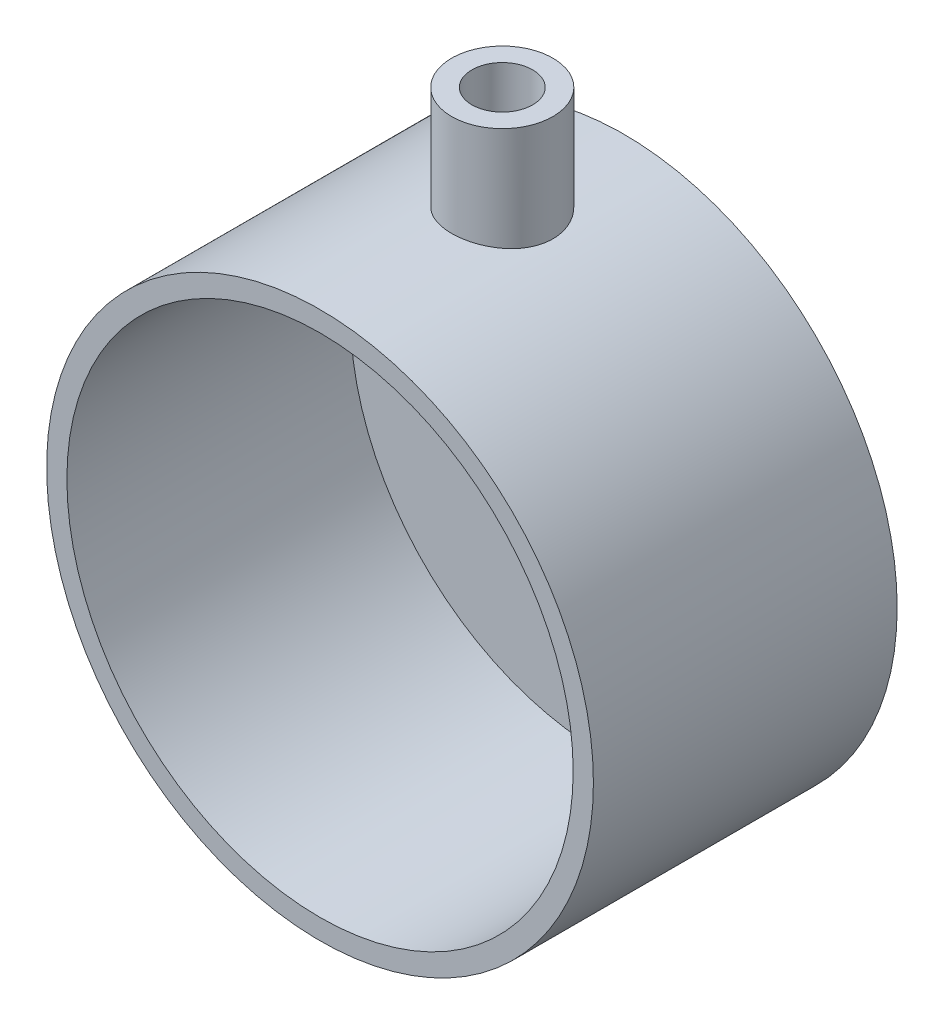
ISO-10303-21;
HEADER;
FILE_DESCRIPTION(('STEP AP214'),'2;1');
FILE_NAME('part.step','',(''),(''),'','','');
FILE_SCHEMA(('AUTOMOTIVE_DESIGN { 1 0 10303 214 1 1 1 1 }'));
ENDSEC;
DATA;
#1=APPLICATION_CONTEXT('core data for automotive mechanical design processes');
#2=APPLICATION_PROTOCOL_DEFINITION('international standard','automotive_design',2000,#1);
#3=PRODUCT_CONTEXT('',#1,'mechanical');
#4=PRODUCT('Part','Part','',(#3));
#5=PRODUCT_RELATED_PRODUCT_CATEGORY('part','',(#4));
#6=PRODUCT_DEFINITION_FORMATION('','',#4);
#7=PRODUCT_DEFINITION_CONTEXT('part definition',#1,'design');
#8=PRODUCT_DEFINITION('design','',#6,#7);
#9=PRODUCT_DEFINITION_SHAPE('','',#8);
#10=(LENGTH_UNIT() NAMED_UNIT(*) SI_UNIT(.MILLI.,.METRE.));
#11=(NAMED_UNIT(*) PLANE_ANGLE_UNIT() SI_UNIT($,.RADIAN.));
#12=(NAMED_UNIT(*) SI_UNIT($,.STERADIAN.) SOLID_ANGLE_UNIT());
#13=UNCERTAINTY_MEASURE_WITH_UNIT(LENGTH_MEASURE(1.E-05),#10,'distance_accuracy_value','');
#14=(GEOMETRIC_REPRESENTATION_CONTEXT(3) GLOBAL_UNCERTAINTY_ASSIGNED_CONTEXT((#13)) GLOBAL_UNIT_ASSIGNED_CONTEXT((#10,
#11,#12)) REPRESENTATION_CONTEXT('',''));
#15=CARTESIAN_POINT('',(0.,0.,0.));
#16=DIRECTION('',(0.,0.,1.));
#17=DIRECTION('',(1.,0.,0.));
#18=AXIS2_PLACEMENT_3D('',#15,#16,#17);
#19=CARTESIAN_POINT('',(0.,0.,2.));
#20=DIRECTION('',(0.,0.,-1.));
#21=DIRECTION('',(-1.,0.,0.));
#22=AXIS2_PLACEMENT_3D('',#19,#20,#21);
#23=CYLINDRICAL_SURFACE('',#22,27.);
#24=CARTESIAN_POINT('',(0.,27.,17.));
#25=CARTESIAN_POINT('',(-0.139198402917014,27.0000011760326,17.0000024699379));
#26=CARTESIAN_POINT('',(-0.278364741431727,26.998921618947,16.9941854977806));
#27=CARTESIAN_POINT('',(-0.555737001810642,26.9946360919045,16.9709675004771));
#28=CARTESIAN_POINT('',(-0.693942743802336,26.9914297339944,16.9535643618775));
#29=CARTESIAN_POINT('',(-0.968433858074517,26.9829762754062,16.9072928039426));
#30=CARTESIAN_POINT('',(-1.10471808993002,26.9777280116532,16.8784178500327));
#31=CARTESIAN_POINT('',(-1.37437288093466,26.9653355643094,16.8094151357267));
#32=CARTESIAN_POINT('',(-1.50774235059126,26.9581906844812,16.7692832426621));
#33=CARTESIAN_POINT('',(-1.77041125219825,26.9422147776107,16.6781348695009));
#34=CARTESIAN_POINT('',(-1.89971565930157,26.9333859132381,16.6271323403382));
#35=CARTESIAN_POINT('',(-2.15358925706926,26.9142762389755,16.5145698675467));
#36=CARTESIAN_POINT('',(-2.27815668135701,26.9039948940782,16.4530060319632));
#37=CARTESIAN_POINT('',(-2.52160311539132,26.882270136108,16.3198102716848));
#38=CARTESIAN_POINT('',(-2.6404847681323,26.8708272708381,16.2481830870598));
#39=CARTESIAN_POINT('',(-2.87186925318302,26.8470836448711,16.0953145695971));
#40=CARTESIAN_POINT('',(-2.98436968540746,26.8347825652134,16.0140696543718));
#41=CARTESIAN_POINT('',(-3.20329822260329,26.8095346280705,15.8416777842821));
#42=CARTESIAN_POINT('',(-3.30965344061783,26.7965824992416,15.7504390271541));
#43=CARTESIAN_POINT('',(-3.51436118055656,26.7705046387995,15.559336923782));
#44=CARTESIAN_POINT('',(-3.61271072361219,26.7573788446592,15.4594703954246));
#45=CARTESIAN_POINT('',(-3.80066580254504,26.7313288283512,15.2518520140035));
#46=CARTESIAN_POINT('',(-3.89027391740952,26.7184045476821,15.1441025031771));
#47=CARTESIAN_POINT('',(-4.06019218856549,26.6931118949527,14.9213808823963));
#48=CARTESIAN_POINT('',(-4.14049890346408,26.6807437296764,14.806406123313));
#49=CARTESIAN_POINT('',(-4.29176597473289,26.6568312938301,14.5691785019454));
#50=CARTESIAN_POINT('',(-4.36265320753199,26.6452937555931,14.4468783093466));
#51=CARTESIAN_POINT('',(-4.49388512111766,26.6234750384761,14.1965825592915));
#52=CARTESIAN_POINT('',(-4.55422585467415,26.6131943304199,14.0685848918374));
#53=CARTESIAN_POINT('',(-4.66385450609767,26.5942017209862,13.8078818598037));
#54=CARTESIAN_POINT('',(-4.71314723777014,26.5854891366774,13.6751785748495));
#55=CARTESIAN_POINT('',(-4.80034627845553,26.5698816277064,13.4059642558315));
#56=CARTESIAN_POINT('',(-4.83824844410836,26.5629873645764,13.2694518558734));
#57=CARTESIAN_POINT('',(-4.93360282440063,26.5455068588294,12.85889044707));
#58=CARTESIAN_POINT('',(-4.97407286177455,26.5378770786056,12.5805454751035));
#59=CARTESIAN_POINT('',(-5.00781350821562,26.531529781667,12.0210727410099));
#60=CARTESIAN_POINT('',(-5.00108824490366,26.5328114855687,11.7399452243869));
#61=CARTESIAN_POINT('',(-4.94112067014499,26.5440430060161,11.1865112218683));
#62=CARTESIAN_POINT('',(-4.88847647356787,26.5538813635239,10.9141378315625));
#63=CARTESIAN_POINT('',(-4.73909006529292,26.5809467878035,10.3821679286725));
#64=CARTESIAN_POINT('',(-4.64234602147123,26.5981741615496,10.122571947421));
#65=CARTESIAN_POINT('',(-4.40692302242312,26.6381924444912,9.62175743679474));
#66=CARTESIAN_POINT('',(-4.26800169471492,26.6610153586482,9.38065549063888));
#67=CARTESIAN_POINT('',(-3.95233788575468,26.7096321661023,8.92495980288954));
#68=CARTESIAN_POINT('',(-3.775591657246,26.7354263536418,8.71036869100963));
#69=CARTESIAN_POINT('',(-3.38606586091671,26.7875656015517,8.31032766048855));
#70=CARTESIAN_POINT('',(-3.17277436954697,26.8139130365231,8.12537615543644));
#71=CARTESIAN_POINT('',(-2.71792765346526,26.8638256425554,7.7938052179575));
#72=CARTESIAN_POINT('',(-2.47637215844226,26.8873907870028,7.64718615217749));
#73=CARTESIAN_POINT('',(-1.97134041142274,26.9291294720956,7.39637186550687));
#74=CARTESIAN_POINT('',(-1.70783829891926,26.9472965335321,7.29222757082761));
#75=CARTESIAN_POINT('',(-1.16666908303803,26.9761418521993,7.12981819483481));
#76=CARTESIAN_POINT('',(-0.889003450074566,26.9868208851242,7.0715483612524));
#77=CARTESIAN_POINT('',(-0.331678067329905,26.9993806216607,7.003233601309));
#78=CARTESIAN_POINT('',(-0.0521047604580278,27.0013859349809,6.99250561648009));
#79=CARTESIAN_POINT('',(0.504841227279066,26.9967161584468,7.0177481559002));
#80=CARTESIAN_POINT('',(0.782214012865339,26.9900414841897,7.05371644433507));
#81=CARTESIAN_POINT('',(1.32472541033309,26.9688392462935,7.17076256980831));
#82=CARTESIAN_POINT('',(1.58994095417485,26.9543717236507,7.25149564880906));
#83=CARTESIAN_POINT('',(2.10307229237478,26.9191992846172,7.45540728064387));
#84=CARTESIAN_POINT('',(2.35098693344422,26.8984939528987,7.57858865986364));
#85=CARTESIAN_POINT('',(2.82540029765124,26.8528318274112,7.86541788720008));
#86=CARTESIAN_POINT('',(3.05164178995463,26.8278319567766,8.02948419413508));
#87=CARTESIAN_POINT('',(3.47362664401047,26.7764670490438,8.39285971266679));
#88=CARTESIAN_POINT('',(3.66936722957033,26.7501018879675,8.59217212884368));
#89=CARTESIAN_POINT('',(4.02738236994323,26.6985655708327,9.02346741459405));
#90=CARTESIAN_POINT('',(4.18919130474708,26.6734142698489,9.25583951919437));
#91=CARTESIAN_POINT('',(4.47147764079161,26.6275502006372,9.74487919066982));
#92=CARTESIAN_POINT('',(4.59195655448221,26.60683727,10.0015458680594));
#93=CARTESIAN_POINT('',(4.78750295904115,26.5723479341953,10.5306391636166));
#94=CARTESIAN_POINT('',(4.86278597635453,26.5585386610783,10.8029840856091));
#95=CARTESIAN_POINT('',(4.96645343221114,26.5393525646918,11.3568929076955));
#96=CARTESIAN_POINT('',(4.99484301747581,26.5339748160358,11.6384557926253));
#97=CARTESIAN_POINT('',(5.00158852952929,26.532696651101,12.0589089414851));
#98=CARTESIAN_POINT('',(4.99801841818649,26.5333727366401,12.1977290890438));
#99=CARTESIAN_POINT('',(4.97935794118038,26.5368822181021,12.4745513666945));
#100=CARTESIAN_POINT('',(4.9642719264776,26.5397147992527,12.6125537859016));
#101=CARTESIAN_POINT('',(4.92268491008954,26.5474595904347,12.8868075856237));
#102=CARTESIAN_POINT('',(4.89617987477714,26.5523725353184,13.0230583298504));
#103=CARTESIAN_POINT('',(4.83197423775583,26.5641316565512,13.2927606543773));
#104=CARTESIAN_POINT('',(4.79427764615038,26.5709771403993,13.4262132190011));
#105=CARTESIAN_POINT('',(4.7080331044283,26.5863938481191,13.6892466884439));
#106=CARTESIAN_POINT('',(4.65950083237688,26.5949625768803,13.8188328834335));
#107=CARTESIAN_POINT('',(4.55193218479288,26.6135846855079,14.0734032055797));
#108=CARTESIAN_POINT('',(4.49289954674211,26.6236375369025,14.1983889511701));
#109=CARTESIAN_POINT('',(4.36471650732065,26.6449520627182,14.4430157760895));
#110=CARTESIAN_POINT('',(4.29556201217364,26.6562142257511,14.56265466721));
#111=CARTESIAN_POINT('',(4.14766332945921,26.6796268741514,14.7956982357219));
#112=CARTESIAN_POINT('',(4.06892247017643,26.6917770506276,14.9091050570872));
#113=CARTESIAN_POINT('',(3.90112008646803,26.7168217248427,15.1306321808723));
#114=CARTESIAN_POINT('',(3.81192159643535,26.7297246475154,15.2386478083144));
#115=CARTESIAN_POINT('',(3.62482765689544,26.7557384293541,15.4467662061842));
#116=CARTESIAN_POINT('',(3.52693529764822,26.768849213285,15.5468717645477));
#117=CARTESIAN_POINT('',(3.32303121539505,26.7949254742098,15.7385903880359));
#118=CARTESIAN_POINT('',(3.21701470567308,26.8078908602986,15.83019837507));
#119=CARTESIAN_POINT('',(2.99767204355295,26.8333029054358,16.0041917487035));
#120=CARTESIAN_POINT('',(2.88434860000572,26.8457497539332,16.0865805224465));
#121=CARTESIAN_POINT('',(2.65005582718615,26.8698938586938,16.2423071138785));
#122=CARTESIAN_POINT('',(2.52902603241717,26.8815832152708,16.3155552300992));
#123=CARTESIAN_POINT('',(2.28115676236411,26.9037506731026,16.4515504201487));
#124=CARTESIAN_POINT('',(2.15431944836312,26.9142292199292,16.5143013607151));
#125=CARTESIAN_POINT('',(1.8957642577606,26.9336753084542,16.6288284091112));
#126=CARTESIAN_POINT('',(1.76404960331676,26.9426438267518,16.6806116158723));
#127=CARTESIAN_POINT('',(1.49665137338271,26.9588202455209,16.7728443203058));
#128=CARTESIAN_POINT('',(1.36096860954095,26.9660285032595,16.8132961180767));
#129=CARTESIAN_POINT('',(1.02412394362162,26.9813086011654,16.8983181757332));
#130=CARTESIAN_POINT('',(0.82123704178827,26.9882832155661,16.9364000497733));
#131=CARTESIAN_POINT('',(0.412209949645323,26.9976279883876,16.9872388251297));
#132=CARTESIAN_POINT('',(0.206069838726204,26.999998258997,16.9999963434947));
#133=CARTESIAN_POINT('',(0.,27.,17.));
#134=B_SPLINE_CURVE_WITH_KNOTS('',3,(#24,#25,#26,#27,#28,#29,#30,#31,#32,#33,#34,#35,#36,#37,
#38,#39,#40,#41,#42,#43,#44,#45,#46,#47,#48,#49,#50,#51,#52,#53,#54,#55,#56,#57,#58,#59,#60,#61,
#62,#63,#64,#65,#66,#67,#68,#69,#70,#71,#72,#73,#74,#75,#76,#77,#78,#79,#80,#81,#82,#83,#84,#85,
#86,#87,#88,#89,#90,#91,#92,#93,#94,#95,#96,#97,#98,#99,#100,#101,#102,#103,#104,#105,#106,#107,
#108,#109,#110,#111,#112,#113,#114,#115,#116,#117,#118,#119,#120,#121,#122,#123,#124,#125,#126,
#127,#128,#129,#130,#131,#132,#133),.UNSPECIFIED.,.T.,.F.,(4,2,2,2,2,2,2,2,2,2,2,2,2,2,2,2,2,2,
2,2,2,2,2,2,2,2,2,2,2,2,2,2,2,2,2,2,2,2,2,2,2,2,2,2,2,2,2,2,2,2,2,2,2,2,4),(0.,
0.417414414219026,0.834904990619155,1.25263371971893,1.67051600733864,2.08786519661789,
2.50536851522833,2.9226758353476,3.34013908502159,3.761822729252,4.183662569195,
4.60537757474685,5.02724811410075,5.4522229871075,5.87735657611475,6.30230456539235,
6.72740694447776,7.56708366936304,8.40668695846264,9.23551464686313,10.0643767719678,
10.8980951363515,11.7318961342398,12.5785084329708,13.4251288291868,14.2727613393803,
15.1203060292981,15.9556332815038,16.7909205397769,17.6198623968535,18.4488594590207,
19.2867173812501,20.1246515208188,20.9734240496102,21.8221655147125,22.6668267406601,
23.5113952558636,23.9275921239081,24.3436318214425,24.7598186004797,25.1758564331286,
25.5912961604926,26.0065883117972,26.4220488941772,26.8373656421788,27.2589054795571,
27.6802960745885,28.1019368889602,28.5234222801015,28.9487637606396,29.3739482158003,
29.7988566210276,30.2236787138998,30.841635638387,31.4595775056611),.UNSPECIFIED.);
#135=CARTESIAN_POINT('',(0.,27.,17.));
#136=VERTEX_POINT('',#135);
#137=EDGE_CURVE('E55',#136,#136,#134,.T.);
#138=ORIENTED_EDGE('',*,*,#137,.T.);
#139=EDGE_LOOP('',(#138));
#140=FACE_BOUND('',#139,.T.);
#141=CARTESIAN_POINT('',(0.,0.,0.));
#142=DIRECTION('',(0.,0.,1.));
#143=DIRECTION('',(1.,0.,0.));
#144=AXIS2_PLACEMENT_3D('',#141,#142,#143);
#145=CIRCLE('',#144,27.);
#146=CARTESIAN_POINT('',(27.,0.,0.));
#147=VERTEX_POINT('',#146);
#148=EDGE_CURVE('E40',#147,#147,#145,.T.);
#149=ORIENTED_EDGE('',*,*,#148,.T.);
#150=EDGE_LOOP('',(#149));
#151=FACE_BOUND('',#150,.T.);
#152=CARTESIAN_POINT('',(0.,0.,30.));
#153=DIRECTION('',(0.,0.,1.));
#154=DIRECTION('',(1.,0.,0.));
#155=AXIS2_PLACEMENT_3D('',#152,#153,#154);
#156=CIRCLE('',#155,27.);
#157=CARTESIAN_POINT('',(27.,0.,30.));
#158=VERTEX_POINT('',#157);
#159=EDGE_CURVE('E45',#158,#158,#156,.T.);
#160=ORIENTED_EDGE('',*,*,#159,.F.);
#161=EDGE_LOOP('',(#160));
#162=FACE_BOUND('',#161,.T.);
#163=ADVANCED_FACE('F32',(#140,#151,#162),#23,.T.);
#164=CARTESIAN_POINT('',(0.,0.,0.));
#165=DIRECTION('',(0.,0.,1.));
#166=DIRECTION('',(1.,0.,0.));
#167=AXIS2_PLACEMENT_3D('',#164,#165,#166);
#168=PLANE('',#167);
#169=CARTESIAN_POINT('',(0.,0.,0.));
#170=DIRECTION('',(0.,0.,1.));
#171=DIRECTION('',(1.,0.,0.));
#172=AXIS2_PLACEMENT_3D('',#169,#170,#171);
#173=CIRCLE('',#172,2.5);
#174=CARTESIAN_POINT('',(2.5,0.,0.));
#175=VERTEX_POINT('',#174);
#176=EDGE_CURVE('E52',#175,#175,#173,.T.);
#177=ORIENTED_EDGE('',*,*,#176,.T.);
#178=EDGE_LOOP('',(#177));
#179=FACE_BOUND('',#178,.T.);
#180=ORIENTED_EDGE('',*,*,#148,.F.);
#181=EDGE_LOOP('',(#180));
#182=FACE_BOUND('',#181,.T.);
#183=ADVANCED_FACE('F101',(#179,#182),#168,.F.);
#184=CARTESIAN_POINT('',(0.,0.,30.));
#185=DIRECTION('',(0.,0.,1.));
#186=DIRECTION('',(1.,0.,0.));
#187=AXIS2_PLACEMENT_3D('',#184,#185,#186);
#188=PLANE('',#187);
#189=ORIENTED_EDGE('',*,*,#159,.T.);
#190=EDGE_LOOP('',(#189));
#191=FACE_BOUND('',#190,.T.);
#192=CARTESIAN_POINT('',(0.,0.,30.));
#193=DIRECTION('',(0.,0.,1.));
#194=DIRECTION('',(1.,0.,0.));
#195=AXIS2_PLACEMENT_3D('',#192,#193,#194);
#196=CIRCLE('',#195,25.);
#197=CARTESIAN_POINT('',(25.,0.,30.));
#198=VERTEX_POINT('',#197);
#199=EDGE_CURVE('E49',#198,#198,#196,.T.);
#200=ORIENTED_EDGE('',*,*,#199,.F.);
#201=EDGE_LOOP('',(#200));
#202=FACE_BOUND('',#201,.T.);
#203=ADVANCED_FACE('F81',(#191,#202),#188,.T.);
#204=CARTESIAN_POINT('',(0.,0.,30.));
#205=DIRECTION('',(0.,0.,-1.));
#206=DIRECTION('',(-1.,0.,0.));
#207=AXIS2_PLACEMENT_3D('',#204,#205,#206);
#208=CYLINDRICAL_SURFACE('',#207,25.);
#209=CARTESIAN_POINT('',(0.,25.,15.));
#210=CARTESIAN_POINT('',(-0.167864047107698,24.9999977357459,14.9999928360586));
#211=CARTESIAN_POINT('',(-0.33583431733119,24.9982914200408,14.9858633413073));
#212=CARTESIAN_POINT('',(-0.667104571308248,24.991648705422,14.9297189358446));
#213=CARTESIAN_POINT('',(-0.830399429590067,24.9867088933728,14.8876745587494));
#214=CARTESIAN_POINT('',(-1.14747479534053,24.9741559265426,14.776953723474));
#215=CARTESIAN_POINT('',(-1.30126148759225,24.9665445315309,14.7082947931758));
#216=CARTESIAN_POINT('',(-1.595099157832,24.9494959264345,14.5463312649167));
#217=CARTESIAN_POINT('',(-1.73515256713516,24.9400590404141,14.4530310402467));
#218=CARTESIAN_POINT('',(-1.99829131534451,24.920360105442,14.2439251380248));
#219=CARTESIAN_POINT('',(-2.1212966913072,24.9100945030904,14.1280191598881));
#220=CARTESIAN_POINT('',(-2.34615931038342,24.8899239397152,13.8772070351121));
#221=CARTESIAN_POINT('',(-2.44801549826473,24.8800189967068,13.7422999409814));
#222=CARTESIAN_POINT('',(-2.62798342873896,24.8616560370405,13.4567991747016));
#223=CARTESIAN_POINT('',(-2.7060207567257,24.8532025903971,13.3061582754199));
#224=CARTESIAN_POINT('',(-2.8356605730156,24.8387461344686,12.9937912978913));
#225=CARTESIAN_POINT('',(-2.88726398696776,24.8327430393798,12.8320656080307));
#226=CARTESIAN_POINT('',(-2.96232930045399,24.8239006073737,12.5029471406886));
#227=CARTESIAN_POINT('',(-2.98592577987646,24.8210461452543,12.3355854715723));
#228=CARTESIAN_POINT('',(-3.0047237521967,24.8187777690611,11.9992550636358));
#229=CARTESIAN_POINT('',(-2.99992630052848,24.8193637271033,11.830286384783));
#230=CARTESIAN_POINT('',(-2.96218316078668,24.8238961466306,11.4964740352157));
#231=CARTESIAN_POINT('',(-2.92938543222302,24.8278249434675,11.3316133613198));
#232=CARTESIAN_POINT('',(-2.83680346170067,24.8385728087608,11.0097529721786));
#233=CARTESIAN_POINT('',(-2.77701871225814,24.8453919315688,10.852753404821));
#234=CARTESIAN_POINT('',(-2.63199980699862,24.8611722079476,10.5506105317609));
#235=CARTESIAN_POINT('',(-2.54670106203925,24.8701387862198,10.4054985216464));
#236=CARTESIAN_POINT('',(-2.35312173169469,24.8891993987901,10.1315927890842));
#237=CARTESIAN_POINT('',(-2.24484017723156,24.8992934806213,10.0027997550974));
#238=CARTESIAN_POINT('',(-2.0075475556218,24.9195503308637,9.76432891563562));
#239=CARTESIAN_POINT('',(-1.87840890051216,24.929713127424,9.65477803014294));
#240=CARTESIAN_POINT('',(-1.60350795893872,24.9489020798549,9.45888847899969));
#241=CARTESIAN_POINT('',(-1.45774563908004,24.9579282334421,9.37254985998085));
#242=CARTESIAN_POINT('',(-1.15363930826284,24.9738318861702,9.22553671436034));
#243=CARTESIAN_POINT('',(-0.995291578715589,24.9807087472809,9.16486980666956));
#244=CARTESIAN_POINT('',(-0.670556022273438,24.991533065309,9.0710212621491));
#245=CARTESIAN_POINT('',(-0.504168542441622,24.9954806485584,9.03783843999552));
#246=CARTESIAN_POINT('',(-0.169174396374216,24.9999852500304,9.00006374450231));
#247=CARTESIAN_POINT('',(-0.00058772043205139,25.0005630093753,8.9952969675993));
#248=CARTESIAN_POINT('',(0.33498206824326,24.9983187823231,9.01402857786827));
#249=CARTESIAN_POINT('',(0.501965212327329,24.9954968625308,9.03752641129536));
#250=CARTESIAN_POINT('',(0.829074263928357,24.9867833380686,9.11197496400309));
#251=CARTESIAN_POINT('',(0.989219346369035,24.9809010237909,9.16284261305008));
#252=CARTESIAN_POINT('',(1.29870539768646,24.9667255501792,9.29050070335358));
#253=CARTESIAN_POINT('',(1.44804602592347,24.9584323148759,9.36729196149009));
#254=CARTESIAN_POINT('',(1.73246717766504,24.9403085158695,9.54504291590243));
#255=CARTESIAN_POINT('',(1.86747628962751,24.9304708084643,9.64611613781082));
#256=CARTESIAN_POINT('',(2.11867625152204,24.9103817919419,9.86940084640817));
#257=CARTESIAN_POINT('',(2.23486641472949,24.9001304677484,9.99161310414795));
#258=CARTESIAN_POINT('',(2.44574795226154,24.8803059484942,10.2544756154277));
#259=CARTESIAN_POINT('',(2.54032363231939,24.8707365831307,10.3952190153438));
#260=CARTESIAN_POINT('',(2.70449314429332,24.8534214993383,10.6906950250756));
#261=CARTESIAN_POINT('',(2.77408744356074,24.8456757467943,10.8454273731182));
#262=CARTESIAN_POINT('',(2.88612996668159,24.8329105734502,11.1641106088947));
#263=CARTESIAN_POINT('',(2.92864420159346,24.8278845275633,11.3280380118594));
#264=CARTESIAN_POINT('',(2.98553272163517,24.8211085274587,11.6607689694851));
#265=CARTESIAN_POINT('',(2.99990820526081,24.8193584337106,11.8295723161573));
#266=CARTESIAN_POINT('',(3.00009033817931,24.819336326607,12.1661127296372));
#267=CARTESIAN_POINT('',(2.98607873671351,24.8210421863943,12.3338497257713));
#268=CARTESIAN_POINT('',(2.93026848672089,24.8276922947425,12.6645667863942));
#269=CARTESIAN_POINT('',(2.88846982822067,24.8326365444656,12.8275468491756));
#270=CARTESIAN_POINT('',(2.77832739820545,24.8451996524586,13.1441045388887));
#271=CARTESIAN_POINT('',(2.70999165570539,24.8528177016812,13.2976849934955));
#272=CARTESIAN_POINT('',(2.5487328262801,24.8698714539139,13.5912277470701));
#273=CARTESIAN_POINT('',(2.45580952709446,24.8793071726153,13.7311899284593));
#274=CARTESIAN_POINT('',(2.24733689647206,24.8990055122588,13.9944529401088));
#275=CARTESIAN_POINT('',(2.13165203930151,24.9092728581347,14.1176461032663));
#276=CARTESIAN_POINT('',(1.88122093334448,24.9294354968169,14.342942479566));
#277=CARTESIAN_POINT('',(1.74647018263601,24.939330701051,14.4450406976292));
#278=CARTESIAN_POINT('',(1.46119322465137,24.9576721709324,14.6255505779989));
#279=CARTESIAN_POINT('',(1.31061323462418,24.966113221621,14.7038777257223));
#280=CARTESIAN_POINT('',(0.998422751685312,24.9805418519727,14.8340237644426));
#281=CARTESIAN_POINT('',(0.836824564362146,24.9865321180615,14.8858716961804));
#282=CARTESIAN_POINT('',(0.561977101236698,24.9939268325999,14.9490634203381));
#283=CARTESIAN_POINT('',(0.450466569753488,24.996193279433,14.9681374838864));
#284=CARTESIAN_POINT('',(0.225986735693696,24.9992306204204,14.993608143491));
#285=CARTESIAN_POINT('',(0.113017442753627,25.0000015244492,15.0000048232505));
#286=CARTESIAN_POINT('',(0.,25.,15.));
#287=B_SPLINE_CURVE_WITH_KNOTS('',3,(#209,#210,#211,#212,#213,#214,#215,#216,#217,#218,#219,
#220,#221,#222,#223,#224,#225,#226,#227,#228,#229,#230,#231,#232,#233,#234,#235,#236,#237,#238,
#239,#240,#241,#242,#243,#244,#245,#246,#247,#248,#249,#250,#251,#252,#253,#254,#255,#256,#257,
#258,#259,#260,#261,#262,#263,#264,#265,#266,#267,#268,#269,#270,#271,#272,#273,#274,#275,#276,
#277,#278,#279,#280,#281,#282,#283,#284,#285,#286),.UNSPECIFIED.,.T.,.F.,(4,2,2,2,2,2,2,2,2,2,2,
2,2,2,2,2,2,2,2,2,2,2,2,2,2,2,2,2,2,2,2,2,2,2,2,2,2,2,4),(0.,0.503179350956159,1.00689069408623,
1.5102708637556,2.01356175441693,2.51913872195878,3.02474090904883,3.53190689496397,
4.03905511999114,4.54375638343279,5.0484388866848,5.55047092912253,6.05251241253396,
6.55583573710536,7.05918028869262,7.56572944640317,8.07227962172601,8.57898002694279,
9.08565857822619,9.58921522624226,10.0927620090108,10.5947890255775,11.0968318630167,
11.6012692178556,12.1057249760357,12.6128207581672,13.119907053063,13.6257524826489,
14.1315763666154,14.6341719319229,15.1367676776234,15.6392114771388,16.1416596143122,
16.6471952402032,17.1528504352009,17.6602829023946,18.1671576479275,18.5059342945627,
18.8447087043981),.UNSPECIFIED.);
#288=CARTESIAN_POINT('',(0.,25.,15.));
#289=VERTEX_POINT('',#288);
#290=EDGE_CURVE('E84',#289,#289,#287,.T.);
#291=ORIENTED_EDGE('',*,*,#290,.F.);
#292=EDGE_LOOP('',(#291));
#293=FACE_BOUND('',#292,.T.);
#294=CARTESIAN_POINT('',(0.,0.,2.));
#295=DIRECTION('',(0.,0.,1.));
#296=DIRECTION('',(1.,0.,0.));
#297=AXIS2_PLACEMENT_3D('',#294,#295,#296);
#298=CIRCLE('',#297,25.);
#299=CARTESIAN_POINT('',(25.,0.,2.));
#300=VERTEX_POINT('',#299);
#301=EDGE_CURVE('E10',#300,#300,#298,.F.);
#302=ORIENTED_EDGE('',*,*,#301,.T.);
#303=EDGE_LOOP('',(#302));
#304=FACE_BOUND('',#303,.T.);
#305=ORIENTED_EDGE('',*,*,#199,.T.);
#306=EDGE_LOOP('',(#305));
#307=FACE_BOUND('',#306,.T.);
#308=ADVANCED_FACE('F77',(#293,#304,#307),#208,.F.);
#309=CARTESIAN_POINT('',(0.,0.,2.));
#310=DIRECTION('',(0.,0.,1.));
#311=DIRECTION('',(1.,0.,0.));
#312=AXIS2_PLACEMENT_3D('',#309,#310,#311);
#313=PLANE('',#312);
#314=CARTESIAN_POINT('',(0.,0.,2.));
#315=DIRECTION('',(0.,0.,1.));
#316=DIRECTION('',(1.,0.,0.));
#317=AXIS2_PLACEMENT_3D('',#314,#315,#316);
#318=CIRCLE('',#317,2.5);
#319=CARTESIAN_POINT('',(2.5,0.,2.));
#320=VERTEX_POINT('',#319);
#321=EDGE_CURVE('E36',#320,#320,#318,.T.);
#322=ORIENTED_EDGE('',*,*,#321,.F.);
#323=EDGE_LOOP('',(#322));
#324=FACE_BOUND('',#323,.T.);
#325=ORIENTED_EDGE('',*,*,#301,.F.);
#326=EDGE_LOOP('',(#325));
#327=FACE_BOUND('',#326,.T.);
#328=ADVANCED_FACE('F75',(#324,#327),#313,.T.);
#329=CARTESIAN_POINT('',(0.,0.,-15.));
#330=DIRECTION('',(0.,0.,1.));
#331=DIRECTION('',(1.,0.,0.));
#332=AXIS2_PLACEMENT_3D('',#329,#330,#331);
#333=CYLINDRICAL_SURFACE('',#332,2.5);
#334=ORIENTED_EDGE('',*,*,#321,.T.);
#335=EDGE_LOOP('',(#334));
#336=FACE_BOUND('',#335,.T.);
#337=ORIENTED_EDGE('',*,*,#176,.F.);
#338=EDGE_LOOP('',(#337));
#339=FACE_BOUND('',#338,.T.);
#340=ADVANCED_FACE('F70',(#336,#339),#333,.F.);
#341=CARTESIAN_POINT('',(0.,25.,12.));
#342=DIRECTION('',(0.,1.,0.));
#343=DIRECTION('',(0.,0.,1.));
#344=AXIS2_PLACEMENT_3D('',#341,#342,#343);
#345=CYLINDRICAL_SURFACE('',#344,5.);
#346=CARTESIAN_POINT('',(0.,37.,12.));
#347=DIRECTION('',(0.,1.,0.));
#348=DIRECTION('',(0.,0.,1.));
#349=AXIS2_PLACEMENT_3D('',#346,#347,#348);
#350=CIRCLE('',#349,5.);
#351=CARTESIAN_POINT('',(0.,37.,17.));
#352=VERTEX_POINT('',#351);
#353=EDGE_CURVE('E62',#352,#352,#350,.T.);
#354=ORIENTED_EDGE('',*,*,#353,.F.);
#355=EDGE_LOOP('',(#354));
#356=FACE_BOUND('',#355,.T.);
#357=ORIENTED_EDGE('',*,*,#137,.F.);
#358=EDGE_LOOP('',(#357));
#359=FACE_BOUND('',#358,.T.);
#360=ADVANCED_FACE('F64',(#356,#359),#345,.T.);
#361=CARTESIAN_POINT('',(0.,37.,12.));
#362=DIRECTION('',(0.,1.,0.));
#363=DIRECTION('',(0.,0.,1.));
#364=AXIS2_PLACEMENT_3D('',#361,#362,#363);
#365=PLANE('',#364);
#366=CARTESIAN_POINT('',(0.,37.,12.));
#367=DIRECTION('',(0.,1.,0.));
#368=DIRECTION('',(0.,0.,1.));
#369=AXIS2_PLACEMENT_3D('',#366,#367,#368);
#370=CIRCLE('',#369,3.);
#371=CARTESIAN_POINT('',(0.,37.,15.));
#372=VERTEX_POINT('',#371);
#373=EDGE_CURVE('E90',#372,#372,#370,.T.);
#374=ORIENTED_EDGE('',*,*,#373,.F.);
#375=EDGE_LOOP('',(#374));
#376=FACE_BOUND('',#375,.T.);
#377=ORIENTED_EDGE('',*,*,#353,.T.);
#378=EDGE_LOOP('',(#377));
#379=FACE_BOUND('',#378,.T.);
#380=ADVANCED_FACE('F69',(#376,#379),#365,.T.);
#381=CARTESIAN_POINT('',(0.,-13.,12.));
#382=DIRECTION('',(0.,1.,0.));
#383=DIRECTION('',(0.,0.,1.));
#384=AXIS2_PLACEMENT_3D('',#381,#382,#383);
#385=CYLINDRICAL_SURFACE('',#384,3.);
#386=ORIENTED_EDGE('',*,*,#290,.T.);
#387=EDGE_LOOP('',(#386));
#388=FACE_BOUND('',#387,.T.);
#389=ORIENTED_EDGE('',*,*,#373,.T.);
#390=EDGE_LOOP('',(#389));
#391=FACE_BOUND('',#390,.T.);
#392=ADVANCED_FACE('F91',(#388,#391),#385,.F.);
#393=CLOSED_SHELL('',(#163,#183,#203,#308,#328,#340,#360,#380,#392));
#394=MANIFOLD_SOLID_BREP('B2',#393);
#395=ADVANCED_BREP_SHAPE_REPRESENTATION('',(#18,#394),#14);
#396=SHAPE_DEFINITION_REPRESENTATION(#9,#395);
ENDSEC;
END-ISO-10303-21;
